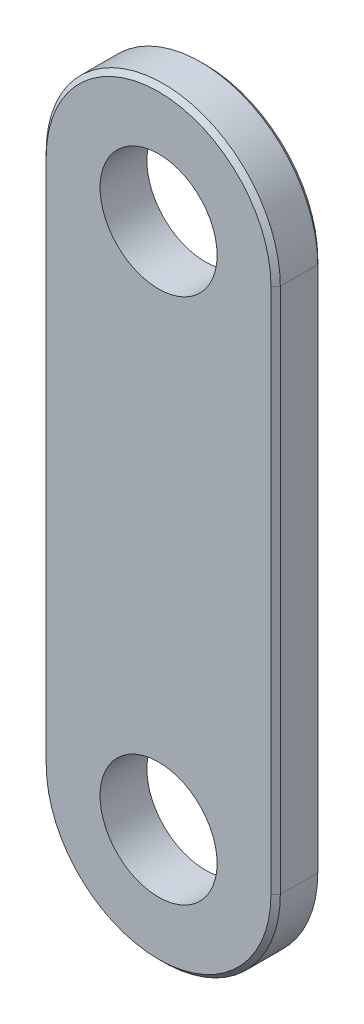
ISO-10303-21;
HEADER;
FILE_DESCRIPTION(('STEP AP214'),'2;1');
FILE_NAME('part.step','',(''),(''),'','','');
FILE_SCHEMA(('AUTOMOTIVE_DESIGN { 1 0 10303 214 1 1 1 1 }'));
ENDSEC;
DATA;
#1=APPLICATION_CONTEXT('core data for automotive mechanical design processes');
#2=APPLICATION_PROTOCOL_DEFINITION('international standard','automotive_design',2000,#1);
#3=PRODUCT_CONTEXT('',#1,'mechanical');
#4=PRODUCT('Part','Part','',(#3));
#5=PRODUCT_RELATED_PRODUCT_CATEGORY('part','',(#4));
#6=PRODUCT_DEFINITION_FORMATION('','',#4);
#7=PRODUCT_DEFINITION_CONTEXT('part definition',#1,'design');
#8=PRODUCT_DEFINITION('design','',#6,#7);
#9=PRODUCT_DEFINITION_SHAPE('','',#8);
#10=(LENGTH_UNIT() NAMED_UNIT(*) SI_UNIT(.MILLI.,.METRE.));
#11=(NAMED_UNIT(*) PLANE_ANGLE_UNIT() SI_UNIT($,.RADIAN.));
#12=(NAMED_UNIT(*) SI_UNIT($,.STERADIAN.) SOLID_ANGLE_UNIT());
#13=UNCERTAINTY_MEASURE_WITH_UNIT(LENGTH_MEASURE(1.E-05),#10,'distance_accuracy_value','');
#14=(GEOMETRIC_REPRESENTATION_CONTEXT(3) GLOBAL_UNCERTAINTY_ASSIGNED_CONTEXT((#13)) GLOBAL_UNIT_ASSIGNED_CONTEXT((#10,
#11,#12)) REPRESENTATION_CONTEXT('',''));
#15=CARTESIAN_POINT('',(0.,0.,0.));
#16=DIRECTION('',(0.,0.,1.));
#17=DIRECTION('',(1.,0.,0.));
#18=AXIS2_PLACEMENT_3D('',#15,#16,#17);
#19=CARTESIAN_POINT('',(0.,111.475422903456,20.));
#20=DIRECTION('',(0.,0.,-1.));
#21=DIRECTION('',(-1.,0.,0.));
#22=AXIS2_PLACEMENT_3D('',#19,#20,#21);
#23=CYLINDRICAL_SURFACE('',#22,50.);
#24=DIRECTION('',(0.,0.,-1.));
#25=VECTOR('',#24,1.);
#26=CARTESIAN_POINT('',(50.,111.475422903456,20.));
#27=LINE('',#26,#25);
#28=CARTESIAN_POINT('',(50.,111.475422903456,18.0000000000001));
#29=VERTEX_POINT('',#28);
#30=CARTESIAN_POINT('',(50.,111.475422903456,1.99999999999997));
#31=VERTEX_POINT('',#30);
#32=EDGE_CURVE('E106',#29,#31,#27,.T.);
#33=ORIENTED_EDGE('',*,*,#32,.T.);
#34=CARTESIAN_POINT('',(0.,111.475422903456,1.99999999999997));
#35=DIRECTION('',(0.,0.,1.));
#36=DIRECTION('',(1.,0.,0.));
#37=AXIS2_PLACEMENT_3D('',#34,#35,#36);
#38=CIRCLE('',#37,50.);
#39=CARTESIAN_POINT('',(-50.,111.475422903456,1.99999999999997));
#40=VERTEX_POINT('',#39);
#41=EDGE_CURVE('E112',#31,#40,#38,.T.);
#42=ORIENTED_EDGE('',*,*,#41,.T.);
#43=DIRECTION('',(0.,0.,-1.));
#44=VECTOR('',#43,1.);
#45=CARTESIAN_POINT('',(-50.,111.475422903456,20.));
#46=LINE('',#45,#44);
#47=CARTESIAN_POINT('',(-50.,111.475422903456,18.0000000000001));
#48=VERTEX_POINT('',#47);
#49=EDGE_CURVE('E133',#48,#40,#46,.T.);
#50=ORIENTED_EDGE('',*,*,#49,.F.);
#51=CARTESIAN_POINT('',(0.,111.475422903456,18.0000000000001));
#52=DIRECTION('',(0.,0.,1.));
#53=DIRECTION('',(1.,0.,0.));
#54=AXIS2_PLACEMENT_3D('',#51,#52,#53);
#55=CIRCLE('',#54,50.);
#56=EDGE_CURVE('E197',#48,#29,#55,.F.);
#57=ORIENTED_EDGE('',*,*,#56,.T.);
#58=EDGE_LOOP('',(#33,#42,#50,#57));
#59=FACE_BOUND('',#58,.T.);
#60=ADVANCED_FACE('F34',(#59),#23,.T.);
#61=CARTESIAN_POINT('',(-50.,111.475422903456,20.));
#62=DIRECTION('',(1.,0.,0.));
#63=DIRECTION('',(0.,1.,0.));
#64=AXIS2_PLACEMENT_3D('',#61,#62,#63);
#65=PLANE('',#64);
#66=ORIENTED_EDGE('',*,*,#49,.T.);
#67=DIRECTION('',(0.,-1.,0.));
#68=VECTOR('',#67,1.);
#69=CARTESIAN_POINT('',(-50.,111.475422903456,1.99999999999997));
#70=LINE('',#69,#68);
#71=CARTESIAN_POINT('',(-50.,-113.524577096544,1.99999999999997));
#72=VERTEX_POINT('',#71);
#73=EDGE_CURVE('E195',#40,#72,#70,.T.);
#74=ORIENTED_EDGE('',*,*,#73,.T.);
#75=DIRECTION('',(0.,0.,-1.));
#76=VECTOR('',#75,1.);
#77=CARTESIAN_POINT('',(-50.,-113.524577096544,20.));
#78=LINE('',#77,#76);
#79=CARTESIAN_POINT('',(-50.,-113.524577096544,18.0000000000001));
#80=VERTEX_POINT('',#79);
#81=EDGE_CURVE('E124',#80,#72,#78,.T.);
#82=ORIENTED_EDGE('',*,*,#81,.F.);
#83=DIRECTION('',(0.,1.,0.));
#84=VECTOR('',#83,1.);
#85=CARTESIAN_POINT('',(-50.,111.475422903456,18.0000000000001));
#86=LINE('',#85,#84);
#87=EDGE_CURVE('E193',#80,#48,#86,.T.);
#88=ORIENTED_EDGE('',*,*,#87,.T.);
#89=EDGE_LOOP('',(#66,#74,#82,#88));
#90=FACE_BOUND('',#89,.T.);
#91=ADVANCED_FACE('F209',(#90),#65,.F.);
#92=CARTESIAN_POINT('',(0.,-113.524577096544,20.));
#93=DIRECTION('',(0.,0.,-1.));
#94=DIRECTION('',(-1.,0.,0.));
#95=AXIS2_PLACEMENT_3D('',#92,#93,#94);
#96=CYLINDRICAL_SURFACE('',#95,50.);
#97=ORIENTED_EDGE('',*,*,#81,.T.);
#98=CARTESIAN_POINT('',(0.,-113.524577096544,1.99999999999997));
#99=DIRECTION('',(0.,0.,1.));
#100=DIRECTION('',(1.,0.,0.));
#101=AXIS2_PLACEMENT_3D('',#98,#99,#100);
#102=CIRCLE('',#101,50.);
#103=CARTESIAN_POINT('',(50.,-113.524577096544,1.99999999999997));
#104=VERTEX_POINT('',#103);
#105=EDGE_CURVE('E123',#72,#104,#102,.T.);
#106=ORIENTED_EDGE('',*,*,#105,.T.);
#107=DIRECTION('',(0.,0.,-1.));
#108=VECTOR('',#107,1.);
#109=CARTESIAN_POINT('',(50.,-113.524577096544,20.));
#110=LINE('',#109,#108);
#111=CARTESIAN_POINT('',(50.,-113.524577096544,18.0000000000001));
#112=VERTEX_POINT('',#111);
#113=EDGE_CURVE('E104',#112,#104,#110,.T.);
#114=ORIENTED_EDGE('',*,*,#113,.F.);
#115=CARTESIAN_POINT('',(0.,-113.524577096544,18.0000000000001));
#116=DIRECTION('',(0.,0.,1.));
#117=DIRECTION('',(1.,0.,0.));
#118=AXIS2_PLACEMENT_3D('',#115,#116,#117);
#119=CIRCLE('',#118,50.);
#120=EDGE_CURVE('E120',#112,#80,#119,.F.);
#121=ORIENTED_EDGE('',*,*,#120,.T.);
#122=EDGE_LOOP('',(#97,#106,#114,#121));
#123=FACE_BOUND('',#122,.T.);
#124=ADVANCED_FACE('F119',(#123),#96,.T.);
#125=CARTESIAN_POINT('',(50.,111.475422903456,20.));
#126=DIRECTION('',(1.,0.,0.));
#127=DIRECTION('',(0.,1.,0.));
#128=AXIS2_PLACEMENT_3D('',#125,#126,#127);
#129=PLANE('',#128);
#130=ORIENTED_EDGE('',*,*,#113,.T.);
#131=DIRECTION('',(0.,1.,0.));
#132=VECTOR('',#131,1.);
#133=CARTESIAN_POINT('',(50.,111.475422903456,1.99999999999997));
#134=LINE('',#133,#132);
#135=EDGE_CURVE('E111',#104,#31,#134,.T.);
#136=ORIENTED_EDGE('',*,*,#135,.T.);
#137=ORIENTED_EDGE('',*,*,#32,.F.);
#138=DIRECTION('',(0.,-1.,0.));
#139=VECTOR('',#138,1.);
#140=CARTESIAN_POINT('',(50.,111.475422903456,18.0000000000001));
#141=LINE('',#140,#139);
#142=EDGE_CURVE('E101',#29,#112,#141,.T.);
#143=ORIENTED_EDGE('',*,*,#142,.T.);
#144=EDGE_LOOP('',(#130,#136,#137,#143));
#145=FACE_BOUND('',#144,.T.);
#146=ADVANCED_FACE('F103',(#145),#129,.T.);
#147=CARTESIAN_POINT('',(0.,111.475422903456,20.));
#148=DIRECTION('',(0.,0.,1.));
#149=DIRECTION('',(1.,0.,0.));
#150=AXIS2_PLACEMENT_3D('',#147,#148,#149);
#151=PLANE('',#150);
#152=DIRECTION('',(0.,-1.,0.));
#153=VECTOR('',#152,1.);
#154=CARTESIAN_POINT('',(-48.,-113.524577096544,20.));
#155=LINE('',#154,#153);
#156=CARTESIAN_POINT('',(-48.,111.475422903456,20.));
#157=VERTEX_POINT('',#156);
#158=CARTESIAN_POINT('',(-48.,-113.524577096544,20.));
#159=VERTEX_POINT('',#158);
#160=EDGE_CURVE('E44',#157,#159,#155,.T.);
#161=ORIENTED_EDGE('',*,*,#160,.T.);
#162=CARTESIAN_POINT('',(0.,-113.524577096544,20.));
#163=DIRECTION('',(0.,0.,1.));
#164=DIRECTION('',(1.,0.,0.));
#165=AXIS2_PLACEMENT_3D('',#162,#163,#164);
#166=CIRCLE('',#165,48.);
#167=CARTESIAN_POINT('',(48.0000000000001,-113.524577096544,20.));
#168=VERTEX_POINT('',#167);
#169=EDGE_CURVE('E11',#159,#168,#166,.T.);
#170=ORIENTED_EDGE('',*,*,#169,.T.);
#171=DIRECTION('',(0.,1.,0.));
#172=VECTOR('',#171,1.);
#173=CARTESIAN_POINT('',(48.,111.475422903456,20.));
#174=LINE('',#173,#172);
#175=CARTESIAN_POINT('',(48.,111.475422903456,20.));
#176=VERTEX_POINT('',#175);
#177=EDGE_CURVE('E136',#168,#176,#174,.T.);
#178=ORIENTED_EDGE('',*,*,#177,.T.);
#179=CARTESIAN_POINT('',(0.,111.475422903456,20.));
#180=DIRECTION('',(0.,0.,1.));
#181=DIRECTION('',(1.,0.,0.));
#182=AXIS2_PLACEMENT_3D('',#179,#180,#181);
#183=CIRCLE('',#182,48.);
#184=EDGE_CURVE('E55',#176,#157,#183,.T.);
#185=ORIENTED_EDGE('',*,*,#184,.T.);
#186=EDGE_LOOP('',(#161,#170,#178,#185));
#187=FACE_BOUND('',#186,.T.);
#188=CARTESIAN_POINT('',(0.,111.475422903456,20.));
#189=DIRECTION('',(0.,0.,1.));
#190=DIRECTION('',(1.,0.,0.));
#191=AXIS2_PLACEMENT_3D('',#188,#189,#190);
#192=CIRCLE('',#191,25.);
#193=CARTESIAN_POINT('',(25.,111.475422903456,20.));
#194=VERTEX_POINT('',#193);
#195=EDGE_CURVE('E176',#194,#194,#192,.F.);
#196=ORIENTED_EDGE('',*,*,#195,.T.);
#197=EDGE_LOOP('',(#196));
#198=FACE_BOUND('',#197,.T.);
#199=CARTESIAN_POINT('',(0.,-113.524577096544,20.));
#200=DIRECTION('',(0.,0.,1.));
#201=DIRECTION('',(1.,0.,0.));
#202=AXIS2_PLACEMENT_3D('',#199,#200,#201);
#203=CIRCLE('',#202,25.);
#204=CARTESIAN_POINT('',(25.,-113.524577096544,20.));
#205=VERTEX_POINT('',#204);
#206=EDGE_CURVE('E171',#205,#205,#203,.F.);
#207=ORIENTED_EDGE('',*,*,#206,.T.);
#208=EDGE_LOOP('',(#207));
#209=FACE_BOUND('',#208,.T.);
#210=ADVANCED_FACE('F202',(#187,#198,#209),#151,.T.);
#211=CARTESIAN_POINT('',(0.,111.475422903456,0.));
#212=DIRECTION('',(0.,0.,1.));
#213=DIRECTION('',(1.,0.,0.));
#214=AXIS2_PLACEMENT_3D('',#211,#212,#213);
#215=PLANE('',#214);
#216=DIRECTION('',(0.,-1.,0.));
#217=VECTOR('',#216,1.);
#218=CARTESIAN_POINT('',(48.,-113.524577096544,0.));
#219=LINE('',#218,#217);
#220=CARTESIAN_POINT('',(48.,111.475422903456,0.));
#221=VERTEX_POINT('',#220);
#222=CARTESIAN_POINT('',(48.,-113.524577096544,0.));
#223=VERTEX_POINT('',#222);
#224=EDGE_CURVE('E184',#221,#223,#219,.T.);
#225=ORIENTED_EDGE('',*,*,#224,.T.);
#226=CARTESIAN_POINT('',(0.,-113.524577096544,0.));
#227=DIRECTION('',(0.,0.,1.));
#228=DIRECTION('',(1.,0.,0.));
#229=AXIS2_PLACEMENT_3D('',#226,#227,#228);
#230=CIRCLE('',#229,48.);
#231=CARTESIAN_POINT('',(-48.,-113.524577096544,0.));
#232=VERTEX_POINT('',#231);
#233=EDGE_CURVE('E190',#223,#232,#230,.F.);
#234=ORIENTED_EDGE('',*,*,#233,.T.);
#235=DIRECTION('',(0.,1.,0.));
#236=VECTOR('',#235,1.);
#237=CARTESIAN_POINT('',(-48.,111.475422903456,0.));
#238=LINE('',#237,#236);
#239=CARTESIAN_POINT('',(-48.,111.475422903456,0.));
#240=VERTEX_POINT('',#239);
#241=EDGE_CURVE('E188',#232,#240,#238,.T.);
#242=ORIENTED_EDGE('',*,*,#241,.T.);
#243=CARTESIAN_POINT('',(0.,111.475422903456,0.));
#244=DIRECTION('',(0.,0.,1.));
#245=DIRECTION('',(1.,0.,0.));
#246=AXIS2_PLACEMENT_3D('',#243,#244,#245);
#247=CIRCLE('',#246,48.);
#248=EDGE_CURVE('E186',#240,#221,#247,.F.);
#249=ORIENTED_EDGE('',*,*,#248,.T.);
#250=EDGE_LOOP('',(#225,#234,#242,#249));
#251=FACE_BOUND('',#250,.T.);
#252=CARTESIAN_POINT('',(0.,111.475422903456,0.));
#253=DIRECTION('',(0.,0.,1.));
#254=DIRECTION('',(1.,0.,0.));
#255=AXIS2_PLACEMENT_3D('',#252,#253,#254);
#256=CIRCLE('',#255,25.);
#257=CARTESIAN_POINT('',(25.,111.475422903456,0.));
#258=VERTEX_POINT('',#257);
#259=EDGE_CURVE('E166',#258,#258,#256,.T.);
#260=ORIENTED_EDGE('',*,*,#259,.T.);
#261=EDGE_LOOP('',(#260));
#262=FACE_BOUND('',#261,.T.);
#263=CARTESIAN_POINT('',(0.,-113.524577096544,0.));
#264=DIRECTION('',(0.,0.,1.));
#265=DIRECTION('',(1.,0.,0.));
#266=AXIS2_PLACEMENT_3D('',#263,#264,#265);
#267=CIRCLE('',#266,25.);
#268=CARTESIAN_POINT('',(25.,-113.524577096544,0.));
#269=VERTEX_POINT('',#268);
#270=EDGE_CURVE('E160',#269,#269,#267,.T.);
#271=ORIENTED_EDGE('',*,*,#270,.T.);
#272=EDGE_LOOP('',(#271));
#273=FACE_BOUND('',#272,.T.);
#274=ADVANCED_FACE('F238',(#251,#262,#273),#215,.F.);
#275=CARTESIAN_POINT('',(0.,-113.524577096544,149.));
#276=DIRECTION('',(0.,0.,-1.));
#277=DIRECTION('',(-1.,0.,0.));
#278=AXIS2_PLACEMENT_3D('',#275,#276,#277);
#279=CYLINDRICAL_SURFACE('',#278,25.);
#280=ORIENTED_EDGE('',*,*,#206,.F.);
#281=EDGE_LOOP('',(#280));
#282=FACE_BOUND('',#281,.T.);
#283=ORIENTED_EDGE('',*,*,#270,.F.);
#284=EDGE_LOOP('',(#283));
#285=FACE_BOUND('',#284,.T.);
#286=ADVANCED_FACE('F241',(#282,#285),#279,.F.);
#287=CARTESIAN_POINT('',(0.,111.475422903456,149.));
#288=DIRECTION('',(0.,0.,-1.));
#289=DIRECTION('',(-1.,0.,0.));
#290=AXIS2_PLACEMENT_3D('',#287,#288,#289);
#291=CYLINDRICAL_SURFACE('',#290,25.);
#292=ORIENTED_EDGE('',*,*,#195,.F.);
#293=EDGE_LOOP('',(#292));
#294=FACE_BOUND('',#293,.T.);
#295=ORIENTED_EDGE('',*,*,#259,.F.);
#296=EDGE_LOOP('',(#295));
#297=FACE_BOUND('',#296,.T.);
#298=ADVANCED_FACE('F247',(#294,#297),#291,.F.);
#299=CARTESIAN_POINT('',(0.,111.475422903456,1.99999999999997));
#300=DIRECTION('',(0.,0.,1.));
#301=DIRECTION('',(1.,0.,0.));
#302=AXIS2_PLACEMENT_3D('',#299,#300,#301);
#303=CONICAL_SURFACE('',#302,50.,0.785398163397448);
#304=DIRECTION('',(0.707106781186547,0.,0.707106781186547));
#305=VECTOR('',#304,1.);
#306=CARTESIAN_POINT('',(48.,111.475422903456,0.));
#307=LINE('',#306,#305);
#308=EDGE_CURVE('E152',#221,#31,#307,.T.);
#309=ORIENTED_EDGE('',*,*,#308,.F.);
#310=ORIENTED_EDGE('',*,*,#248,.F.);
#311=DIRECTION('',(0.707106781186547,0.,-0.707106781186547));
#312=VECTOR('',#311,1.);
#313=CARTESIAN_POINT('',(-50.,111.475422903456,1.99999999999997));
#314=LINE('',#313,#312);
#315=EDGE_CURVE('E141',#40,#240,#314,.T.);
#316=ORIENTED_EDGE('',*,*,#315,.F.);
#317=ORIENTED_EDGE('',*,*,#41,.F.);
#318=EDGE_LOOP('',(#309,#310,#316,#317));
#319=FACE_BOUND('',#318,.T.);
#320=ADVANCED_FACE('F213',(#319),#303,.T.);
#321=CARTESIAN_POINT('',(-50.,111.475422903456,1.99999999999997));
#322=DIRECTION('',(0.707106781186547,0.,0.707106781186547));
#323=DIRECTION('',(0.,-1.,0.));
#324=AXIS2_PLACEMENT_3D('',#321,#322,#323);
#325=PLANE('',#324);
#326=ORIENTED_EDGE('',*,*,#315,.T.);
#327=ORIENTED_EDGE('',*,*,#241,.F.);
#328=DIRECTION('',(0.707106781186547,0.,-0.707106781186547));
#329=VECTOR('',#328,1.);
#330=CARTESIAN_POINT('',(-50.,-113.524577096544,1.99999999999997));
#331=LINE('',#330,#329);
#332=EDGE_CURVE('E146',#72,#232,#331,.T.);
#333=ORIENTED_EDGE('',*,*,#332,.F.);
#334=ORIENTED_EDGE('',*,*,#73,.F.);
#335=EDGE_LOOP('',(#326,#327,#333,#334));
#336=FACE_BOUND('',#335,.T.);
#337=ADVANCED_FACE('F216',(#336),#325,.F.);
#338=CARTESIAN_POINT('',(48.,111.475422903456,0.));
#339=DIRECTION('',(0.707106781186547,0.,-0.707106781186547));
#340=DIRECTION('',(0.,1.,0.));
#341=AXIS2_PLACEMENT_3D('',#338,#339,#340);
#342=PLANE('',#341);
#343=ORIENTED_EDGE('',*,*,#308,.T.);
#344=ORIENTED_EDGE('',*,*,#135,.F.);
#345=DIRECTION('',(0.707106781186547,0.,0.707106781186547));
#346=VECTOR('',#345,1.);
#347=CARTESIAN_POINT('',(48.,-113.524577096544,0.));
#348=LINE('',#347,#346);
#349=EDGE_CURVE('E144',#223,#104,#348,.T.);
#350=ORIENTED_EDGE('',*,*,#349,.F.);
#351=ORIENTED_EDGE('',*,*,#224,.F.);
#352=EDGE_LOOP('',(#343,#344,#350,#351));
#353=FACE_BOUND('',#352,.T.);
#354=ADVANCED_FACE('F219',(#353),#342,.T.);
#355=CARTESIAN_POINT('',(0.,-113.524577096544,1.99999999999997));
#356=DIRECTION('',(0.,0.,1.));
#357=DIRECTION('',(1.,0.,0.));
#358=AXIS2_PLACEMENT_3D('',#355,#356,#357);
#359=CONICAL_SURFACE('',#358,50.,0.785398163397448);
#360=ORIENTED_EDGE('',*,*,#332,.T.);
#361=ORIENTED_EDGE('',*,*,#233,.F.);
#362=ORIENTED_EDGE('',*,*,#349,.T.);
#363=ORIENTED_EDGE('',*,*,#105,.F.);
#364=EDGE_LOOP('',(#360,#361,#362,#363));
#365=FACE_BOUND('',#364,.T.);
#366=ADVANCED_FACE('F217',(#365),#359,.T.);
#367=CARTESIAN_POINT('',(0.,111.475422903456,20.));
#368=DIRECTION('',(0.,0.,-1.));
#369=DIRECTION('',(-1.,0.,0.));
#370=AXIS2_PLACEMENT_3D('',#367,#368,#369);
#371=CONICAL_SURFACE('',#370,48.,0.785398163397448);
#372=DIRECTION('',(-0.707106781186548,0.,0.707106781186548));
#373=VECTOR('',#372,1.);
#374=CARTESIAN_POINT('',(50.,111.475422903456,18.0000000000001));
#375=LINE('',#374,#373);
#376=EDGE_CURVE('E138',#29,#176,#375,.T.);
#377=ORIENTED_EDGE('',*,*,#376,.F.);
#378=ORIENTED_EDGE('',*,*,#56,.F.);
#379=DIRECTION('',(-0.707106781186548,0.,-0.707106781186548));
#380=VECTOR('',#379,1.);
#381=CARTESIAN_POINT('',(-48.,111.475422903456,20.));
#382=LINE('',#381,#380);
#383=EDGE_CURVE('E39',#157,#48,#382,.T.);
#384=ORIENTED_EDGE('',*,*,#383,.F.);
#385=ORIENTED_EDGE('',*,*,#184,.F.);
#386=EDGE_LOOP('',(#377,#378,#384,#385));
#387=FACE_BOUND('',#386,.T.);
#388=ADVANCED_FACE('F37',(#387),#371,.T.);
#389=CARTESIAN_POINT('',(-48.,111.475422903456,20.));
#390=DIRECTION('',(-0.707106781186548,0.,0.707106781186548));
#391=DIRECTION('',(0.,1.,0.));
#392=AXIS2_PLACEMENT_3D('',#389,#390,#391);
#393=PLANE('',#392);
#394=ORIENTED_EDGE('',*,*,#383,.T.);
#395=ORIENTED_EDGE('',*,*,#87,.F.);
#396=DIRECTION('',(-0.707106781186548,0.,-0.707106781186548));
#397=VECTOR('',#396,1.);
#398=CARTESIAN_POINT('',(-48.,-113.524577096544,20.));
#399=LINE('',#398,#397);
#400=EDGE_CURVE('E131',#159,#80,#399,.T.);
#401=ORIENTED_EDGE('',*,*,#400,.F.);
#402=ORIENTED_EDGE('',*,*,#160,.F.);
#403=EDGE_LOOP('',(#394,#395,#401,#402));
#404=FACE_BOUND('',#403,.T.);
#405=ADVANCED_FACE('F206',(#404),#393,.T.);
#406=CARTESIAN_POINT('',(50.,111.475422903456,18.0000000000001));
#407=DIRECTION('',(-0.707106781186548,0.,-0.707106781186548));
#408=DIRECTION('',(0.,-1.,0.));
#409=AXIS2_PLACEMENT_3D('',#406,#407,#408);
#410=PLANE('',#409);
#411=ORIENTED_EDGE('',*,*,#376,.T.);
#412=ORIENTED_EDGE('',*,*,#177,.F.);
#413=DIRECTION('',(-0.707106781186548,0.,0.707106781186548));
#414=VECTOR('',#413,1.);
#415=CARTESIAN_POINT('',(50.,-113.524577096544,18.0000000000001));
#416=LINE('',#415,#414);
#417=EDGE_CURVE('E129',#112,#168,#416,.T.);
#418=ORIENTED_EDGE('',*,*,#417,.F.);
#419=ORIENTED_EDGE('',*,*,#142,.F.);
#420=EDGE_LOOP('',(#411,#412,#418,#419));
#421=FACE_BOUND('',#420,.T.);
#422=ADVANCED_FACE('F135',(#421),#410,.F.);
#423=CARTESIAN_POINT('',(0.,-113.524577096544,20.));
#424=DIRECTION('',(0.,0.,-1.));
#425=DIRECTION('',(-1.,0.,0.));
#426=AXIS2_PLACEMENT_3D('',#423,#424,#425);
#427=CONICAL_SURFACE('',#426,48.,0.785398163397448);
#428=ORIENTED_EDGE('',*,*,#400,.T.);
#429=ORIENTED_EDGE('',*,*,#120,.F.);
#430=ORIENTED_EDGE('',*,*,#417,.T.);
#431=ORIENTED_EDGE('',*,*,#169,.F.);
#432=EDGE_LOOP('',(#428,#429,#430,#431));
#433=FACE_BOUND('',#432,.T.);
#434=ADVANCED_FACE('F127',(#433),#427,.T.);
#435=CLOSED_SHELL('',(#60,#91,#124,#146,#210,#274,#286,#298,#320,#337,#354,#366,#388,#405,#422,#434));
#436=MANIFOLD_SOLID_BREP('B2',#435);
#437=ADVANCED_BREP_SHAPE_REPRESENTATION('',(#18,#436),#14);
#438=SHAPE_DEFINITION_REPRESENTATION(#9,#437);
ENDSEC;
END-ISO-10303-21;
